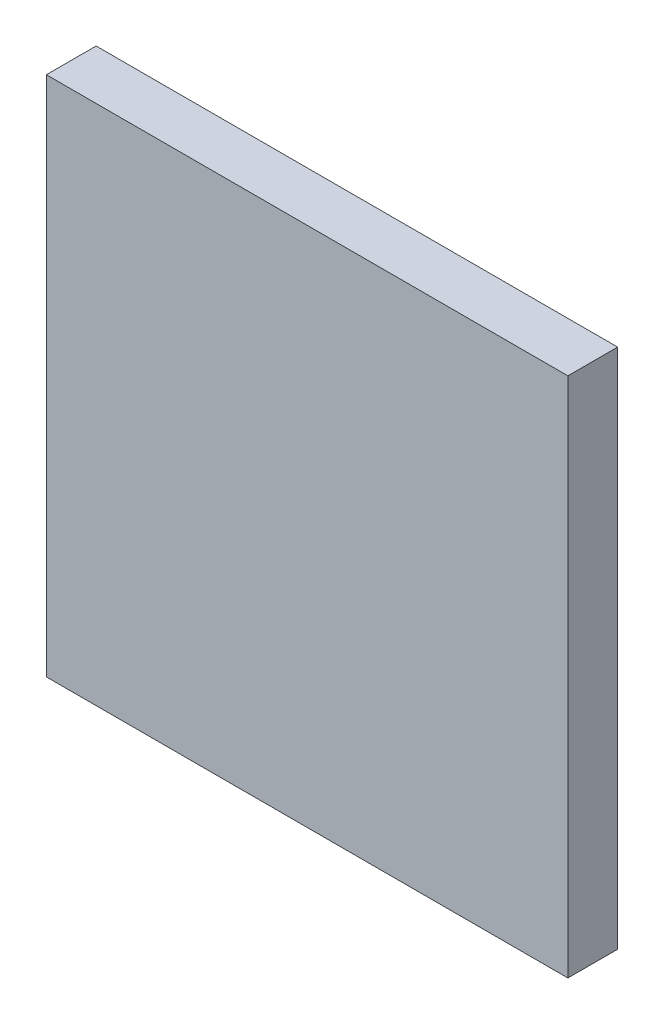
ISO-10303-21;
HEADER;
FILE_DESCRIPTION(('STEP AP214'),'2;1');
FILE_NAME('part.step','',(''),(''),'','','');
FILE_SCHEMA(('AUTOMOTIVE_DESIGN { 1 0 10303 214 1 1 1 1 }'));
ENDSEC;
DATA;
#1=APPLICATION_CONTEXT('core data for automotive mechanical design processes');
#2=APPLICATION_PROTOCOL_DEFINITION('international standard','automotive_design',2000,#1);
#3=PRODUCT_CONTEXT('',#1,'mechanical');
#4=PRODUCT('Part','Part','',(#3));
#5=PRODUCT_RELATED_PRODUCT_CATEGORY('part','',(#4));
#6=PRODUCT_DEFINITION_FORMATION('','',#4);
#7=PRODUCT_DEFINITION_CONTEXT('part definition',#1,'design');
#8=PRODUCT_DEFINITION('design','',#6,#7);
#9=PRODUCT_DEFINITION_SHAPE('','',#8);
#10=(LENGTH_UNIT() NAMED_UNIT(*) SI_UNIT(.MILLI.,.METRE.));
#11=(NAMED_UNIT(*) PLANE_ANGLE_UNIT() SI_UNIT($,.RADIAN.));
#12=(NAMED_UNIT(*) SI_UNIT($,.STERADIAN.) SOLID_ANGLE_UNIT());
#13=UNCERTAINTY_MEASURE_WITH_UNIT(LENGTH_MEASURE(1.E-05),#10,'distance_accuracy_value','');
#14=(GEOMETRIC_REPRESENTATION_CONTEXT(3) GLOBAL_UNCERTAINTY_ASSIGNED_CONTEXT((#13)) GLOBAL_UNIT_ASSIGNED_CONTEXT((#10,
#11,#12)) REPRESENTATION_CONTEXT('',''));
#15=CARTESIAN_POINT('',(0.,0.,0.));
#16=DIRECTION('',(0.,0.,1.));
#17=DIRECTION('',(1.,0.,0.));
#18=AXIS2_PLACEMENT_3D('',#15,#16,#17);
#19=CARTESIAN_POINT('',(-7.84,-25.,3.34));
#20=DIRECTION('',(0.,-1.,0.));
#21=DIRECTION('',(0.,0.,-1.));
#22=AXIS2_PLACEMENT_3D('',#19,#20,#21);
#23=PLANE('',#22);
#24=DIRECTION('',(-1.,0.,0.));
#25=VECTOR('',#24,1.);
#26=CARTESIAN_POINT('',(-7.84,-25.,0.));
#27=LINE('',#26,#25);
#28=CARTESIAN_POINT('',(-7.84,-25.,0.));
#29=VERTEX_POINT('',#28);
#30=CARTESIAN_POINT('',(-42.84,-25.,0.));
#31=VERTEX_POINT('',#30);
#32=EDGE_CURVE('E104',#29,#31,#27,.T.);
#33=ORIENTED_EDGE('',*,*,#32,.T.);
#34=DIRECTION('',(0.,0.,-1.));
#35=VECTOR('',#34,1.);
#36=CARTESIAN_POINT('',(-42.84,-25.,3.34));
#37=LINE('',#36,#35);
#38=CARTESIAN_POINT('',(-42.84,-25.,3.34));
#39=VERTEX_POINT('',#38);
#40=EDGE_CURVE('E11',#39,#31,#37,.T.);
#41=ORIENTED_EDGE('',*,*,#40,.F.);
#42=DIRECTION('',(-1.,0.,0.));
#43=VECTOR('',#42,1.);
#44=CARTESIAN_POINT('',(-7.84,-25.,3.34));
#45=LINE('',#44,#43);
#46=CARTESIAN_POINT('',(-7.84,-25.,3.34));
#47=VERTEX_POINT('',#46);
#48=EDGE_CURVE('E92',#47,#39,#45,.T.);
#49=ORIENTED_EDGE('',*,*,#48,.F.);
#50=DIRECTION('',(0.,0.,-1.));
#51=VECTOR('',#50,1.);
#52=CARTESIAN_POINT('',(-7.84,-25.,3.34));
#53=LINE('',#52,#51);
#54=EDGE_CURVE('E100',#47,#29,#53,.T.);
#55=ORIENTED_EDGE('',*,*,#54,.T.);
#56=EDGE_LOOP('',(#33,#41,#49,#55));
#57=FACE_BOUND('',#56,.T.);
#58=ADVANCED_FACE('F41',(#57),#23,.F.);
#59=CARTESIAN_POINT('',(-42.84,-25.,3.34));
#60=DIRECTION('',(1.,0.,0.));
#61=DIRECTION('',(0.,0.,-1.));
#62=AXIS2_PLACEMENT_3D('',#59,#60,#61);
#63=PLANE('',#62);
#64=DIRECTION('',(0.,-1.,0.));
#65=VECTOR('',#64,1.);
#66=CARTESIAN_POINT('',(-42.84,-25.,0.));
#67=LINE('',#66,#65);
#68=CARTESIAN_POINT('',(-42.84,-60.,0.));
#69=VERTEX_POINT('',#68);
#70=EDGE_CURVE('E96',#31,#69,#67,.T.);
#71=ORIENTED_EDGE('',*,*,#70,.T.);
#72=DIRECTION('',(0.,0.,-1.));
#73=VECTOR('',#72,1.);
#74=CARTESIAN_POINT('',(-42.84,-60.,3.34));
#75=LINE('',#74,#73);
#76=CARTESIAN_POINT('',(-42.84,-60.,3.34));
#77=VERTEX_POINT('',#76);
#78=EDGE_CURVE('E49',#77,#69,#75,.T.);
#79=ORIENTED_EDGE('',*,*,#78,.F.);
#80=DIRECTION('',(0.,-1.,0.));
#81=VECTOR('',#80,1.);
#82=CARTESIAN_POINT('',(-42.84,-25.,3.34));
#83=LINE('',#82,#81);
#84=EDGE_CURVE('E87',#39,#77,#83,.T.);
#85=ORIENTED_EDGE('',*,*,#84,.F.);
#86=ORIENTED_EDGE('',*,*,#40,.T.);
#87=EDGE_LOOP('',(#71,#79,#85,#86));
#88=FACE_BOUND('',#87,.T.);
#89=ADVANCED_FACE('F95',(#88),#63,.F.);
#90=CARTESIAN_POINT('',(-42.84,-60.,3.34));
#91=DIRECTION('',(0.,1.,0.));
#92=DIRECTION('',(0.,0.,1.));
#93=AXIS2_PLACEMENT_3D('',#90,#91,#92);
#94=PLANE('',#93);
#95=DIRECTION('',(1.,0.,0.));
#96=VECTOR('',#95,1.);
#97=CARTESIAN_POINT('',(-42.84,-60.,0.));
#98=LINE('',#97,#96);
#99=CARTESIAN_POINT('',(-7.84,-60.,0.));
#100=VERTEX_POINT('',#99);
#101=EDGE_CURVE('E74',#69,#100,#98,.T.);
#102=ORIENTED_EDGE('',*,*,#101,.T.);
#103=DIRECTION('',(0.,0.,-1.));
#104=VECTOR('',#103,1.);
#105=CARTESIAN_POINT('',(-7.84,-60.,3.34));
#106=LINE('',#105,#104);
#107=CARTESIAN_POINT('',(-7.84,-60.,3.34));
#108=VERTEX_POINT('',#107);
#109=EDGE_CURVE('E97',#108,#100,#106,.T.);
#110=ORIENTED_EDGE('',*,*,#109,.F.);
#111=DIRECTION('',(1.,0.,0.));
#112=VECTOR('',#111,1.);
#113=CARTESIAN_POINT('',(-42.84,-60.,3.34));
#114=LINE('',#113,#112);
#115=EDGE_CURVE('E90',#77,#108,#114,.T.);
#116=ORIENTED_EDGE('',*,*,#115,.F.);
#117=ORIENTED_EDGE('',*,*,#78,.T.);
#118=EDGE_LOOP('',(#102,#110,#116,#117));
#119=FACE_BOUND('',#118,.T.);
#120=ADVANCED_FACE('F98',(#119),#94,.F.);
#121=CARTESIAN_POINT('',(-7.84,-60.,3.34));
#122=DIRECTION('',(-1.,0.,0.));
#123=DIRECTION('',(0.,0.,1.));
#124=AXIS2_PLACEMENT_3D('',#121,#122,#123);
#125=PLANE('',#124);
#126=DIRECTION('',(0.,1.,0.));
#127=VECTOR('',#126,1.);
#128=CARTESIAN_POINT('',(-7.84,-60.,0.));
#129=LINE('',#128,#127);
#130=EDGE_CURVE('E80',#100,#29,#129,.T.);
#131=ORIENTED_EDGE('',*,*,#130,.T.);
#132=ORIENTED_EDGE('',*,*,#54,.F.);
#133=DIRECTION('',(0.,1.,0.));
#134=VECTOR('',#133,1.);
#135=CARTESIAN_POINT('',(-7.84,-60.,3.34));
#136=LINE('',#135,#134);
#137=EDGE_CURVE('E57',#108,#47,#136,.T.);
#138=ORIENTED_EDGE('',*,*,#137,.F.);
#139=ORIENTED_EDGE('',*,*,#109,.T.);
#140=EDGE_LOOP('',(#131,#132,#138,#139));
#141=FACE_BOUND('',#140,.T.);
#142=ADVANCED_FACE('F111',(#141),#125,.F.);
#143=CARTESIAN_POINT('',(-42.84,-25.,3.34));
#144=DIRECTION('',(0.,0.,1.));
#145=DIRECTION('',(1.,0.,0.));
#146=AXIS2_PLACEMENT_3D('',#143,#144,#145);
#147=PLANE('',#146);
#148=ORIENTED_EDGE('',*,*,#48,.T.);
#149=ORIENTED_EDGE('',*,*,#84,.T.);
#150=ORIENTED_EDGE('',*,*,#115,.T.);
#151=ORIENTED_EDGE('',*,*,#137,.T.);
#152=EDGE_LOOP('',(#148,#149,#150,#151));
#153=FACE_BOUND('',#152,.T.);
#154=ADVANCED_FACE('F88',(#153),#147,.T.);
#155=CARTESIAN_POINT('',(-42.84,-25.,0.));
#156=DIRECTION('',(0.,0.,1.));
#157=DIRECTION('',(1.,0.,0.));
#158=AXIS2_PLACEMENT_3D('',#155,#156,#157);
#159=PLANE('',#158);
#160=ORIENTED_EDGE('',*,*,#32,.F.);
#161=ORIENTED_EDGE('',*,*,#130,.F.);
#162=ORIENTED_EDGE('',*,*,#101,.F.);
#163=ORIENTED_EDGE('',*,*,#70,.F.);
#164=EDGE_LOOP('',(#160,#161,#162,#163));
#165=FACE_BOUND('',#164,.T.);
#166=ADVANCED_FACE('F114',(#165),#159,.F.);
#167=CLOSED_SHELL('',(#58,#89,#120,#142,#154,#166));
#168=MANIFOLD_SOLID_BREP('B2',#167);
#169=ADVANCED_BREP_SHAPE_REPRESENTATION('',(#18,#168),#14);
#170=SHAPE_DEFINITION_REPRESENTATION(#9,#169);
ENDSEC;
END-ISO-10303-21;
